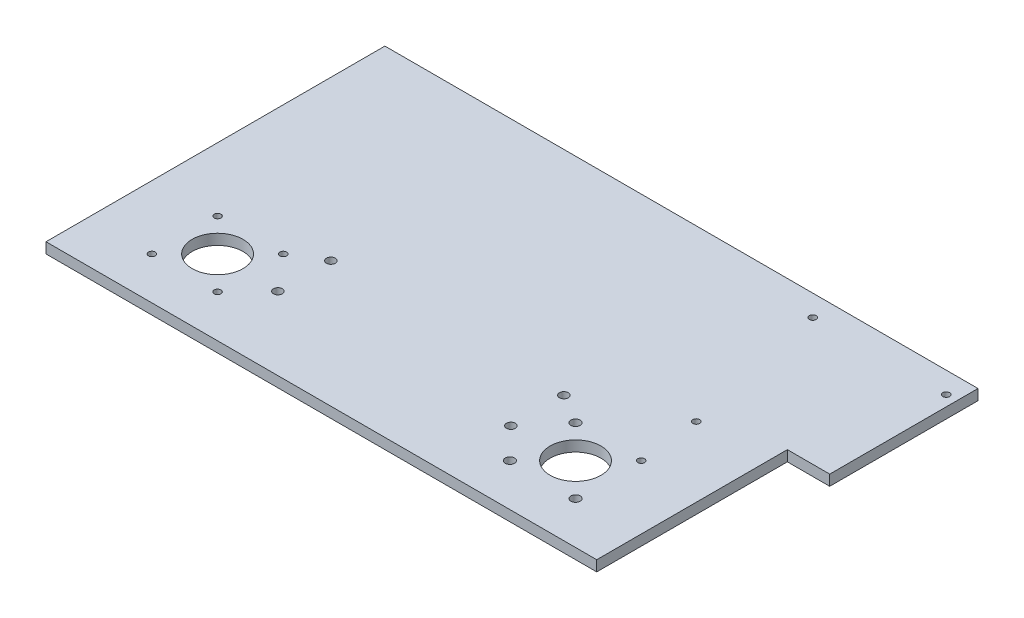
ISO-10303-21;
HEADER;
FILE_DESCRIPTION(('STEP AP214'),'2;1');
FILE_NAME('part.step','',(''),(''),'','','');
FILE_SCHEMA(('AUTOMOTIVE_DESIGN { 1 0 10303 214 1 1 1 1 }'));
ENDSEC;
DATA;
#1=APPLICATION_CONTEXT('core data for automotive mechanical design processes');
#2=APPLICATION_PROTOCOL_DEFINITION('international standard','automotive_design',2000,#1);
#3=PRODUCT_CONTEXT('',#1,'mechanical');
#4=PRODUCT('Part','Part','',(#3));
#5=PRODUCT_RELATED_PRODUCT_CATEGORY('part','',(#4));
#6=PRODUCT_DEFINITION_FORMATION('','',#4);
#7=PRODUCT_DEFINITION_CONTEXT('part definition',#1,'design');
#8=PRODUCT_DEFINITION('design','',#6,#7);
#9=PRODUCT_DEFINITION_SHAPE('','',#8);
#10=(LENGTH_UNIT() NAMED_UNIT(*) SI_UNIT(.MILLI.,.METRE.));
#11=(NAMED_UNIT(*) PLANE_ANGLE_UNIT() SI_UNIT($,.RADIAN.));
#12=(NAMED_UNIT(*) SI_UNIT($,.STERADIAN.) SOLID_ANGLE_UNIT());
#13=UNCERTAINTY_MEASURE_WITH_UNIT(LENGTH_MEASURE(1.E-05),#10,'distance_accuracy_value','');
#14=(GEOMETRIC_REPRESENTATION_CONTEXT(3) GLOBAL_UNCERTAINTY_ASSIGNED_CONTEXT((#13)) GLOBAL_UNIT_ASSIGNED_CONTEXT((#10,
#11,#12)) REPRESENTATION_CONTEXT('',''));
#15=CARTESIAN_POINT('',(0.,0.,0.));
#16=DIRECTION('',(0.,0.,1.));
#17=DIRECTION('',(1.,0.,0.));
#18=AXIS2_PLACEMENT_3D('',#15,#16,#17);
#19=CARTESIAN_POINT('',(0.,5.,80.));
#20=DIRECTION('',(0.,0.,-1.));
#21=DIRECTION('',(-1.,0.,0.));
#22=AXIS2_PLACEMENT_3D('',#19,#20,#21);
#23=PLANE('',#22);
#24=DIRECTION('',(1.,0.,0.));
#25=VECTOR('',#24,1.);
#26=CARTESIAN_POINT('',(0.,0.,80.));
#27=LINE('',#26,#25);
#28=CARTESIAN_POINT('',(-140.,0.,80.));
#29=VERTEX_POINT('',#28);
#30=CARTESIAN_POINT('',(120.,0.,80.));
#31=VERTEX_POINT('',#30);
#32=EDGE_CURVE('E169',#29,#31,#27,.T.);
#33=ORIENTED_EDGE('',*,*,#32,.T.);
#34=DIRECTION('',(0.,-1.,0.));
#35=VECTOR('',#34,1.);
#36=CARTESIAN_POINT('',(120.,5.,80.));
#37=LINE('',#36,#35);
#38=CARTESIAN_POINT('',(120.,5.,80.));
#39=VERTEX_POINT('',#38);
#40=EDGE_CURVE('E11',#39,#31,#37,.T.);
#41=ORIENTED_EDGE('',*,*,#40,.F.);
#42=DIRECTION('',(1.,0.,0.));
#43=VECTOR('',#42,1.);
#44=CARTESIAN_POINT('',(0.,5.,80.));
#45=LINE('',#44,#43);
#46=CARTESIAN_POINT('',(-140.,5.,80.));
#47=VERTEX_POINT('',#46);
#48=EDGE_CURVE('E530',#47,#39,#45,.T.);
#49=ORIENTED_EDGE('',*,*,#48,.F.);
#50=DIRECTION('',(0.,-1.,0.));
#51=VECTOR('',#50,1.);
#52=CARTESIAN_POINT('',(-140.,5.,80.));
#53=LINE('',#52,#51);
#54=EDGE_CURVE('E50',#47,#29,#53,.T.);
#55=ORIENTED_EDGE('',*,*,#54,.T.);
#56=EDGE_LOOP('',(#33,#41,#49,#55));
#57=FACE_BOUND('',#56,.T.);
#58=ADVANCED_FACE('F33',(#57),#23,.F.);
#59=CARTESIAN_POINT('',(120.,5.,0.));
#60=DIRECTION('',(-1.,0.,0.));
#61=DIRECTION('',(0.,0.,1.));
#62=AXIS2_PLACEMENT_3D('',#59,#60,#61);
#63=PLANE('',#62);
#64=DIRECTION('',(0.,0.,-1.));
#65=VECTOR('',#64,1.);
#66=CARTESIAN_POINT('',(120.,0.,0.));
#67=LINE('',#66,#65);
#68=CARTESIAN_POINT('',(120.,0.,-9.99999999999998));
#69=VERTEX_POINT('',#68);
#70=EDGE_CURVE('E171',#31,#69,#67,.T.);
#71=ORIENTED_EDGE('',*,*,#70,.T.);
#72=DIRECTION('',(0.,-1.,0.));
#73=VECTOR('',#72,1.);
#74=CARTESIAN_POINT('',(120.,5.,-9.99999999999998));
#75=LINE('',#74,#73);
#76=CARTESIAN_POINT('',(120.,5.,-9.99999999999998));
#77=VERTEX_POINT('',#76);
#78=EDGE_CURVE('E42',#77,#69,#75,.T.);
#79=ORIENTED_EDGE('',*,*,#78,.F.);
#80=DIRECTION('',(0.,0.,-1.));
#81=VECTOR('',#80,1.);
#82=CARTESIAN_POINT('',(120.,5.,0.));
#83=LINE('',#82,#81);
#84=EDGE_CURVE('E82',#39,#77,#83,.T.);
#85=ORIENTED_EDGE('',*,*,#84,.F.);
#86=ORIENTED_EDGE('',*,*,#40,.T.);
#87=EDGE_LOOP('',(#71,#79,#85,#86));
#88=FACE_BOUND('',#87,.T.);
#89=ADVANCED_FACE('F189',(#88),#63,.F.);
#90=CARTESIAN_POINT('',(0.,5.,-9.99999999999996));
#91=DIRECTION('',(0.,0.,1.));
#92=DIRECTION('',(1.,0.,0.));
#93=AXIS2_PLACEMENT_3D('',#90,#91,#92);
#94=PLANE('',#93);
#95=DIRECTION('',(-1.,0.,0.));
#96=VECTOR('',#95,1.);
#97=CARTESIAN_POINT('',(0.,0.,-9.99999999999996));
#98=LINE('',#97,#96);
#99=CARTESIAN_POINT('',(140.,0.,-9.99999999999998));
#100=VERTEX_POINT('',#99);
#101=EDGE_CURVE('E174',#100,#69,#98,.T.);
#102=ORIENTED_EDGE('',*,*,#101,.F.);
#103=DIRECTION('',(0.,-1.,0.));
#104=VECTOR('',#103,1.);
#105=CARTESIAN_POINT('',(140.,5.,-9.99999999999998));
#106=LINE('',#105,#104);
#107=CARTESIAN_POINT('',(140.,5.,-9.99999999999998));
#108=VERTEX_POINT('',#107);
#109=EDGE_CURVE('E110',#108,#100,#106,.T.);
#110=ORIENTED_EDGE('',*,*,#109,.F.);
#111=DIRECTION('',(-1.,0.,0.));
#112=VECTOR('',#111,1.);
#113=CARTESIAN_POINT('',(0.,5.,-9.99999999999996));
#114=LINE('',#113,#112);
#115=EDGE_CURVE('E100',#108,#77,#114,.T.);
#116=ORIENTED_EDGE('',*,*,#115,.T.);
#117=ORIENTED_EDGE('',*,*,#78,.T.);
#118=EDGE_LOOP('',(#102,#110,#116,#117));
#119=FACE_BOUND('',#118,.T.);
#120=ADVANCED_FACE('F188',(#119),#94,.T.);
#121=CARTESIAN_POINT('',(140.,5.,0.));
#122=DIRECTION('',(-1.,0.,0.));
#123=DIRECTION('',(0.,0.,1.));
#124=AXIS2_PLACEMENT_3D('',#121,#122,#123);
#125=PLANE('',#124);
#126=DIRECTION('',(0.,0.,-1.));
#127=VECTOR('',#126,1.);
#128=CARTESIAN_POINT('',(140.,0.,0.));
#129=LINE('',#128,#127);
#130=CARTESIAN_POINT('',(140.,0.,-80.));
#131=VERTEX_POINT('',#130);
#132=EDGE_CURVE('E107',#100,#131,#129,.T.);
#133=ORIENTED_EDGE('',*,*,#132,.T.);
#134=DIRECTION('',(0.,-1.,0.));
#135=VECTOR('',#134,1.);
#136=CARTESIAN_POINT('',(140.,5.,-80.));
#137=LINE('',#136,#135);
#138=CARTESIAN_POINT('',(140.,5.,-80.));
#139=VERTEX_POINT('',#138);
#140=EDGE_CURVE('E104',#139,#131,#137,.T.);
#141=ORIENTED_EDGE('',*,*,#140,.F.);
#142=DIRECTION('',(0.,0.,-1.));
#143=VECTOR('',#142,1.);
#144=CARTESIAN_POINT('',(140.,5.,0.));
#145=LINE('',#144,#143);
#146=EDGE_CURVE('E93',#108,#139,#145,.T.);
#147=ORIENTED_EDGE('',*,*,#146,.F.);
#148=ORIENTED_EDGE('',*,*,#109,.T.);
#149=EDGE_LOOP('',(#133,#141,#147,#148));
#150=FACE_BOUND('',#149,.T.);
#151=ADVANCED_FACE('F105',(#150),#125,.F.);
#152=CARTESIAN_POINT('',(0.,5.,-80.));
#153=DIRECTION('',(0.,0.,-1.));
#154=DIRECTION('',(-1.,0.,0.));
#155=AXIS2_PLACEMENT_3D('',#152,#153,#154);
#156=PLANE('',#155);
#157=DIRECTION('',(1.,0.,0.));
#158=VECTOR('',#157,1.);
#159=CARTESIAN_POINT('',(0.,0.,-80.));
#160=LINE('',#159,#158);
#161=CARTESIAN_POINT('',(-140.,0.,-80.));
#162=VERTEX_POINT('',#161);
#163=EDGE_CURVE('E178',#162,#131,#160,.T.);
#164=ORIENTED_EDGE('',*,*,#163,.F.);
#165=DIRECTION('',(0.,-1.,0.));
#166=VECTOR('',#165,1.);
#167=CARTESIAN_POINT('',(-140.,5.,-80.));
#168=LINE('',#167,#166);
#169=CARTESIAN_POINT('',(-140.,5.,-80.));
#170=VERTEX_POINT('',#169);
#171=EDGE_CURVE('E70',#170,#162,#168,.T.);
#172=ORIENTED_EDGE('',*,*,#171,.F.);
#173=DIRECTION('',(1.,0.,0.));
#174=VECTOR('',#173,1.);
#175=CARTESIAN_POINT('',(0.,5.,-80.));
#176=LINE('',#175,#174);
#177=EDGE_CURVE('E98',#170,#139,#176,.T.);
#178=ORIENTED_EDGE('',*,*,#177,.T.);
#179=ORIENTED_EDGE('',*,*,#140,.T.);
#180=EDGE_LOOP('',(#164,#172,#178,#179));
#181=FACE_BOUND('',#180,.T.);
#182=ADVANCED_FACE('F112',(#181),#156,.T.);
#183=CARTESIAN_POINT('',(90.,5.,29.));
#184=DIRECTION('',(0.,-1.,0.));
#185=DIRECTION('',(0.,0.,-1.));
#186=AXIS2_PLACEMENT_3D('',#183,#184,#185);
#187=CYLINDRICAL_SURFACE('',#186,1.6);
#188=CARTESIAN_POINT('',(90.,5.,29.));
#189=DIRECTION('',(0.,1.,0.));
#190=DIRECTION('',(0.,0.,1.));
#191=AXIS2_PLACEMENT_3D('',#188,#189,#190);
#192=CIRCLE('',#191,1.6);
#193=CARTESIAN_POINT('',(90.,5.,30.6));
#194=VERTEX_POINT('',#193);
#195=EDGE_CURVE('E527',#194,#194,#192,.T.);
#196=ORIENTED_EDGE('',*,*,#195,.T.);
#197=EDGE_LOOP('',(#196));
#198=FACE_BOUND('',#197,.T.);
#199=CARTESIAN_POINT('',(90.,0.,29.));
#200=DIRECTION('',(0.,1.,0.));
#201=DIRECTION('',(0.,0.,1.));
#202=AXIS2_PLACEMENT_3D('',#199,#200,#201);
#203=CIRCLE('',#202,1.6);
#204=CARTESIAN_POINT('',(90.,0.,30.6));
#205=VERTEX_POINT('',#204);
#206=EDGE_CURVE('E166',#205,#205,#203,.T.);
#207=ORIENTED_EDGE('',*,*,#206,.F.);
#208=EDGE_LOOP('',(#207));
#209=FACE_BOUND('',#208,.T.);
#210=ADVANCED_FACE('F214',(#198,#209),#187,.F.);
#211=CARTESIAN_POINT('',(59.,5.,29.));
#212=DIRECTION('',(0.,-1.,0.));
#213=DIRECTION('',(0.,0.,-1.));
#214=AXIS2_PLACEMENT_3D('',#211,#212,#213);
#215=CYLINDRICAL_SURFACE('',#214,2.2);
#216=CARTESIAN_POINT('',(59.,5.,29.));
#217=DIRECTION('',(0.,1.,0.));
#218=DIRECTION('',(0.,0.,1.));
#219=AXIS2_PLACEMENT_3D('',#216,#217,#218);
#220=CIRCLE('',#219,2.2);
#221=CARTESIAN_POINT('',(59.,5.,31.2));
#222=VERTEX_POINT('',#221);
#223=EDGE_CURVE('E524',#222,#222,#220,.T.);
#224=ORIENTED_EDGE('',*,*,#223,.T.);
#225=EDGE_LOOP('',(#224));
#226=FACE_BOUND('',#225,.T.);
#227=CARTESIAN_POINT('',(59.,0.,29.));
#228=DIRECTION('',(0.,1.,0.));
#229=DIRECTION('',(0.,0.,1.));
#230=AXIS2_PLACEMENT_3D('',#227,#228,#229);
#231=CIRCLE('',#230,2.2);
#232=CARTESIAN_POINT('',(59.,0.,31.2));
#233=VERTEX_POINT('',#232);
#234=EDGE_CURVE('E163',#233,#233,#231,.T.);
#235=ORIENTED_EDGE('',*,*,#234,.F.);
#236=EDGE_LOOP('',(#235));
#237=FACE_BOUND('',#236,.T.);
#238=ADVANCED_FACE('F217',(#226,#237),#215,.F.);
#239=CARTESIAN_POINT('',(90.,5.,60.));
#240=DIRECTION('',(0.,-1.,0.));
#241=DIRECTION('',(0.,0.,-1.));
#242=AXIS2_PLACEMENT_3D('',#239,#240,#241);
#243=CYLINDRICAL_SURFACE('',#242,2.2);
#244=CARTESIAN_POINT('',(90.,5.,60.));
#245=DIRECTION('',(0.,1.,0.));
#246=DIRECTION('',(0.,0.,1.));
#247=AXIS2_PLACEMENT_3D('',#244,#245,#246);
#248=CIRCLE('',#247,2.2);
#249=CARTESIAN_POINT('',(90.,5.,62.2));
#250=VERTEX_POINT('',#249);
#251=EDGE_CURVE('E521',#250,#250,#248,.T.);
#252=ORIENTED_EDGE('',*,*,#251,.T.);
#253=EDGE_LOOP('',(#252));
#254=FACE_BOUND('',#253,.T.);
#255=CARTESIAN_POINT('',(90.,0.,60.));
#256=DIRECTION('',(0.,1.,0.));
#257=DIRECTION('',(0.,0.,1.));
#258=AXIS2_PLACEMENT_3D('',#255,#256,#257);
#259=CIRCLE('',#258,2.2);
#260=CARTESIAN_POINT('',(90.,0.,62.2));
#261=VERTEX_POINT('',#260);
#262=EDGE_CURVE('E160',#261,#261,#259,.T.);
#263=ORIENTED_EDGE('',*,*,#262,.F.);
#264=EDGE_LOOP('',(#263));
#265=FACE_BOUND('',#264,.T.);
#266=ADVANCED_FACE('F221',(#254,#265),#243,.F.);
#267=CARTESIAN_POINT('',(59.,5.,60.));
#268=DIRECTION('',(0.,-1.,0.));
#269=DIRECTION('',(0.,0.,-1.));
#270=AXIS2_PLACEMENT_3D('',#267,#268,#269);
#271=CYLINDRICAL_SURFACE('',#270,2.19999999999999);
#272=CARTESIAN_POINT('',(59.,5.,60.));
#273=DIRECTION('',(0.,1.,0.));
#274=DIRECTION('',(0.,0.,1.));
#275=AXIS2_PLACEMENT_3D('',#272,#273,#274);
#276=CIRCLE('',#275,2.19999999999999);
#277=CARTESIAN_POINT('',(59.,5.,62.2));
#278=VERTEX_POINT('',#277);
#279=EDGE_CURVE('E518',#278,#278,#276,.T.);
#280=ORIENTED_EDGE('',*,*,#279,.T.);
#281=EDGE_LOOP('',(#280));
#282=FACE_BOUND('',#281,.T.);
#283=CARTESIAN_POINT('',(59.,0.,60.));
#284=DIRECTION('',(0.,1.,0.));
#285=DIRECTION('',(0.,0.,1.));
#286=AXIS2_PLACEMENT_3D('',#283,#284,#285);
#287=CIRCLE('',#286,2.19999999999999);
#288=CARTESIAN_POINT('',(59.,0.,62.2));
#289=VERTEX_POINT('',#288);
#290=EDGE_CURVE('E157',#289,#289,#287,.T.);
#291=ORIENTED_EDGE('',*,*,#290,.F.);
#292=EDGE_LOOP('',(#291));
#293=FACE_BOUND('',#292,.T.);
#294=ADVANCED_FACE('F225',(#282,#293),#271,.F.);
#295=CARTESIAN_POINT('',(-79.0000000000001,5.,29.));
#296=DIRECTION('',(0.,-1.,0.));
#297=DIRECTION('',(0.,0.,-1.));
#298=AXIS2_PLACEMENT_3D('',#295,#296,#297);
#299=CYLINDRICAL_SURFACE('',#298,1.6);
#300=CARTESIAN_POINT('',(-79.0000000000001,5.,29.));
#301=DIRECTION('',(0.,1.,0.));
#302=DIRECTION('',(0.,0.,1.));
#303=AXIS2_PLACEMENT_3D('',#300,#301,#302);
#304=CIRCLE('',#303,1.6);
#305=CARTESIAN_POINT('',(-79.0000000000001,5.,30.6));
#306=VERTEX_POINT('',#305);
#307=EDGE_CURVE('E515',#306,#306,#304,.T.);
#308=ORIENTED_EDGE('',*,*,#307,.T.);
#309=EDGE_LOOP('',(#308));
#310=FACE_BOUND('',#309,.T.);
#311=CARTESIAN_POINT('',(-79.0000000000001,0.,29.));
#312=DIRECTION('',(0.,1.,0.));
#313=DIRECTION('',(0.,0.,1.));
#314=AXIS2_PLACEMENT_3D('',#311,#312,#313);
#315=CIRCLE('',#314,1.6);
#316=CARTESIAN_POINT('',(-79.0000000000001,0.,30.6));
#317=VERTEX_POINT('',#316);
#318=EDGE_CURVE('E154',#317,#317,#315,.T.);
#319=ORIENTED_EDGE('',*,*,#318,.F.);
#320=EDGE_LOOP('',(#319));
#321=FACE_BOUND('',#320,.T.);
#322=ADVANCED_FACE('F229',(#310,#321),#299,.F.);
#323=CARTESIAN_POINT('',(-110.,5.,29.));
#324=DIRECTION('',(0.,-1.,0.));
#325=DIRECTION('',(0.,0.,-1.));
#326=AXIS2_PLACEMENT_3D('',#323,#324,#325);
#327=CYLINDRICAL_SURFACE('',#326,1.6);
#328=CARTESIAN_POINT('',(-110.,5.,29.));
#329=DIRECTION('',(0.,1.,0.));
#330=DIRECTION('',(0.,0.,1.));
#331=AXIS2_PLACEMENT_3D('',#328,#329,#330);
#332=CIRCLE('',#331,1.6);
#333=CARTESIAN_POINT('',(-110.,5.,30.6));
#334=VERTEX_POINT('',#333);
#335=EDGE_CURVE('E512',#334,#334,#332,.T.);
#336=ORIENTED_EDGE('',*,*,#335,.T.);
#337=EDGE_LOOP('',(#336));
#338=FACE_BOUND('',#337,.T.);
#339=CARTESIAN_POINT('',(-110.,0.,29.));
#340=DIRECTION('',(0.,1.,0.));
#341=DIRECTION('',(0.,0.,1.));
#342=AXIS2_PLACEMENT_3D('',#339,#340,#341);
#343=CIRCLE('',#342,1.6);
#344=CARTESIAN_POINT('',(-110.,0.,30.6));
#345=VERTEX_POINT('',#344);
#346=EDGE_CURVE('E151',#345,#345,#343,.T.);
#347=ORIENTED_EDGE('',*,*,#346,.F.);
#348=EDGE_LOOP('',(#347));
#349=FACE_BOUND('',#348,.T.);
#350=ADVANCED_FACE('F233',(#338,#349),#327,.F.);
#351=CARTESIAN_POINT('',(-79.0000000000001,5.,60.));
#352=DIRECTION('',(0.,-1.,0.));
#353=DIRECTION('',(0.,0.,-1.));
#354=AXIS2_PLACEMENT_3D('',#351,#352,#353);
#355=CYLINDRICAL_SURFACE('',#354,1.60000000000001);
#356=CARTESIAN_POINT('',(-79.0000000000001,5.,60.));
#357=DIRECTION('',(0.,1.,0.));
#358=DIRECTION('',(0.,0.,1.));
#359=AXIS2_PLACEMENT_3D('',#356,#357,#358);
#360=CIRCLE('',#359,1.60000000000001);
#361=CARTESIAN_POINT('',(-79.0000000000001,5.,61.6));
#362=VERTEX_POINT('',#361);
#363=EDGE_CURVE('E509',#362,#362,#360,.T.);
#364=ORIENTED_EDGE('',*,*,#363,.T.);
#365=EDGE_LOOP('',(#364));
#366=FACE_BOUND('',#365,.T.);
#367=CARTESIAN_POINT('',(-79.0000000000001,0.,60.));
#368=DIRECTION('',(0.,1.,0.));
#369=DIRECTION('',(0.,0.,1.));
#370=AXIS2_PLACEMENT_3D('',#367,#368,#369);
#371=CIRCLE('',#370,1.60000000000001);
#372=CARTESIAN_POINT('',(-79.0000000000001,0.,61.6));
#373=VERTEX_POINT('',#372);
#374=EDGE_CURVE('E148',#373,#373,#371,.T.);
#375=ORIENTED_EDGE('',*,*,#374,.F.);
#376=EDGE_LOOP('',(#375));
#377=FACE_BOUND('',#376,.T.);
#378=ADVANCED_FACE('F237',(#366,#377),#355,.F.);
#379=CARTESIAN_POINT('',(-110.,5.,60.));
#380=DIRECTION('',(0.,-1.,0.));
#381=DIRECTION('',(0.,0.,-1.));
#382=AXIS2_PLACEMENT_3D('',#379,#380,#381);
#383=CYLINDRICAL_SURFACE('',#382,1.60000000000001);
#384=CARTESIAN_POINT('',(-110.,5.,60.));
#385=DIRECTION('',(0.,1.,0.));
#386=DIRECTION('',(0.,0.,1.));
#387=AXIS2_PLACEMENT_3D('',#384,#385,#386);
#388=CIRCLE('',#387,1.60000000000001);
#389=CARTESIAN_POINT('',(-110.,5.,61.6));
#390=VERTEX_POINT('',#389);
#391=EDGE_CURVE('E506',#390,#390,#388,.T.);
#392=ORIENTED_EDGE('',*,*,#391,.T.);
#393=EDGE_LOOP('',(#392));
#394=FACE_BOUND('',#393,.T.);
#395=CARTESIAN_POINT('',(-110.,0.,60.));
#396=DIRECTION('',(0.,1.,0.));
#397=DIRECTION('',(0.,0.,1.));
#398=AXIS2_PLACEMENT_3D('',#395,#396,#397);
#399=CIRCLE('',#398,1.60000000000001);
#400=CARTESIAN_POINT('',(-110.,0.,61.6));
#401=VERTEX_POINT('',#400);
#402=EDGE_CURVE('E145',#401,#401,#399,.T.);
#403=ORIENTED_EDGE('',*,*,#402,.F.);
#404=EDGE_LOOP('',(#403));
#405=FACE_BOUND('',#404,.T.);
#406=ADVANCED_FACE('F241',(#394,#405),#383,.F.);
#407=CARTESIAN_POINT('',(45.,5.,20.5));
#408=DIRECTION('',(0.,-1.,0.));
#409=DIRECTION('',(0.,0.,-1.));
#410=AXIS2_PLACEMENT_3D('',#407,#408,#409);
#411=CYLINDRICAL_SURFACE('',#410,2.1);
#412=CARTESIAN_POINT('',(45.,5.,20.5));
#413=DIRECTION('',(0.,1.,0.));
#414=DIRECTION('',(0.,0.,1.));
#415=AXIS2_PLACEMENT_3D('',#412,#413,#414);
#416=CIRCLE('',#415,2.1);
#417=CARTESIAN_POINT('',(45.,5.,22.6));
#418=VERTEX_POINT('',#417);
#419=EDGE_CURVE('E503',#418,#418,#416,.T.);
#420=ORIENTED_EDGE('',*,*,#419,.T.);
#421=EDGE_LOOP('',(#420));
#422=FACE_BOUND('',#421,.T.);
#423=CARTESIAN_POINT('',(45.,0.,20.5));
#424=DIRECTION('',(0.,1.,0.));
#425=DIRECTION('',(0.,0.,1.));
#426=AXIS2_PLACEMENT_3D('',#423,#424,#425);
#427=CIRCLE('',#426,2.1);
#428=CARTESIAN_POINT('',(45.,0.,22.6));
#429=VERTEX_POINT('',#428);
#430=EDGE_CURVE('E142',#429,#429,#427,.T.);
#431=ORIENTED_EDGE('',*,*,#430,.F.);
#432=EDGE_LOOP('',(#431));
#433=FACE_BOUND('',#432,.T.);
#434=ADVANCED_FACE('F245',(#422,#433),#411,.F.);
#435=CARTESIAN_POINT('',(45.,5.,45.5));
#436=DIRECTION('',(0.,-1.,0.));
#437=DIRECTION('',(0.,0.,-1.));
#438=AXIS2_PLACEMENT_3D('',#435,#436,#437);
#439=CYLINDRICAL_SURFACE('',#438,2.1);
#440=CARTESIAN_POINT('',(45.,5.,45.5));
#441=DIRECTION('',(0.,1.,0.));
#442=DIRECTION('',(0.,0.,1.));
#443=AXIS2_PLACEMENT_3D('',#440,#441,#442);
#444=CIRCLE('',#443,2.1);
#445=CARTESIAN_POINT('',(45.,5.,47.6));
#446=VERTEX_POINT('',#445);
#447=EDGE_CURVE('E500',#446,#446,#444,.T.);
#448=ORIENTED_EDGE('',*,*,#447,.T.);
#449=EDGE_LOOP('',(#448));
#450=FACE_BOUND('',#449,.T.);
#451=CARTESIAN_POINT('',(45.,0.,45.5));
#452=DIRECTION('',(0.,1.,0.));
#453=DIRECTION('',(0.,0.,1.));
#454=AXIS2_PLACEMENT_3D('',#451,#452,#453);
#455=CIRCLE('',#454,2.1);
#456=CARTESIAN_POINT('',(45.,0.,47.6));
#457=VERTEX_POINT('',#456);
#458=EDGE_CURVE('E139',#457,#457,#455,.T.);
#459=ORIENTED_EDGE('',*,*,#458,.F.);
#460=EDGE_LOOP('',(#459));
#461=FACE_BOUND('',#460,.T.);
#462=ADVANCED_FACE('F249',(#450,#461),#439,.F.);
#463=CARTESIAN_POINT('',(-65.,5.,45.5));
#464=DIRECTION('',(0.,-1.,0.));
#465=DIRECTION('',(0.,0.,-1.));
#466=AXIS2_PLACEMENT_3D('',#463,#464,#465);
#467=CYLINDRICAL_SURFACE('',#466,2.1);
#468=CARTESIAN_POINT('',(-65.,5.,45.5));
#469=DIRECTION('',(0.,1.,0.));
#470=DIRECTION('',(0.,0.,1.));
#471=AXIS2_PLACEMENT_3D('',#468,#469,#470);
#472=CIRCLE('',#471,2.1);
#473=CARTESIAN_POINT('',(-65.,5.,47.6));
#474=VERTEX_POINT('',#473);
#475=EDGE_CURVE('E497',#474,#474,#472,.T.);
#476=ORIENTED_EDGE('',*,*,#475,.T.);
#477=EDGE_LOOP('',(#476));
#478=FACE_BOUND('',#477,.T.);
#479=CARTESIAN_POINT('',(-65.,0.,45.5));
#480=DIRECTION('',(0.,1.,0.));
#481=DIRECTION('',(0.,0.,1.));
#482=AXIS2_PLACEMENT_3D('',#479,#480,#481);
#483=CIRCLE('',#482,2.1);
#484=CARTESIAN_POINT('',(-65.,0.,47.6));
#485=VERTEX_POINT('',#484);
#486=EDGE_CURVE('E136',#485,#485,#483,.T.);
#487=ORIENTED_EDGE('',*,*,#486,.F.);
#488=EDGE_LOOP('',(#487));
#489=FACE_BOUND('',#488,.T.);
#490=ADVANCED_FACE('F253',(#478,#489),#467,.F.);
#491=CARTESIAN_POINT('',(-65.,5.,20.5));
#492=DIRECTION('',(0.,-1.,0.));
#493=DIRECTION('',(0.,0.,-1.));
#494=AXIS2_PLACEMENT_3D('',#491,#492,#493);
#495=CYLINDRICAL_SURFACE('',#494,2.1);
#496=CARTESIAN_POINT('',(-65.,5.,20.5));
#497=DIRECTION('',(0.,1.,0.));
#498=DIRECTION('',(0.,0.,1.));
#499=AXIS2_PLACEMENT_3D('',#496,#497,#498);
#500=CIRCLE('',#499,2.1);
#501=CARTESIAN_POINT('',(-65.,5.,22.6));
#502=VERTEX_POINT('',#501);
#503=EDGE_CURVE('E494',#502,#502,#500,.T.);
#504=ORIENTED_EDGE('',*,*,#503,.T.);
#505=EDGE_LOOP('',(#504));
#506=FACE_BOUND('',#505,.T.);
#507=CARTESIAN_POINT('',(-65.,0.,20.5));
#508=DIRECTION('',(0.,1.,0.));
#509=DIRECTION('',(0.,0.,1.));
#510=AXIS2_PLACEMENT_3D('',#507,#508,#509);
#511=CIRCLE('',#510,2.1);
#512=CARTESIAN_POINT('',(-65.,0.,22.6));
#513=VERTEX_POINT('',#512);
#514=EDGE_CURVE('E133',#513,#513,#511,.T.);
#515=ORIENTED_EDGE('',*,*,#514,.F.);
#516=EDGE_LOOP('',(#515));
#517=FACE_BOUND('',#516,.T.);
#518=ADVANCED_FACE('F257',(#506,#517),#495,.F.);
#519=CARTESIAN_POINT('',(74.5,5.,44.5));
#520=DIRECTION('',(0.,-1.,0.));
#521=DIRECTION('',(0.,0.,-1.));
#522=AXIS2_PLACEMENT_3D('',#519,#520,#521);
#523=CYLINDRICAL_SURFACE('',#522,12.);
#524=CARTESIAN_POINT('',(74.5,5.,44.5));
#525=DIRECTION('',(0.,1.,0.));
#526=DIRECTION('',(0.,0.,1.));
#527=AXIS2_PLACEMENT_3D('',#524,#525,#526);
#528=CIRCLE('',#527,12.);
#529=CARTESIAN_POINT('',(74.5,5.,56.5));
#530=VERTEX_POINT('',#529);
#531=EDGE_CURVE('E491',#530,#530,#528,.T.);
#532=ORIENTED_EDGE('',*,*,#531,.T.);
#533=EDGE_LOOP('',(#532));
#534=FACE_BOUND('',#533,.T.);
#535=CARTESIAN_POINT('',(74.5,0.,44.5));
#536=DIRECTION('',(0.,1.,0.));
#537=DIRECTION('',(0.,0.,1.));
#538=AXIS2_PLACEMENT_3D('',#535,#536,#537);
#539=CIRCLE('',#538,12.);
#540=CARTESIAN_POINT('',(74.5,0.,56.5));
#541=VERTEX_POINT('',#540);
#542=EDGE_CURVE('E130',#541,#541,#539,.T.);
#543=ORIENTED_EDGE('',*,*,#542,.F.);
#544=EDGE_LOOP('',(#543));
#545=FACE_BOUND('',#544,.T.);
#546=ADVANCED_FACE('F261',(#534,#545),#523,.F.);
#547=CARTESIAN_POINT('',(-94.5000000000001,5.,44.5));
#548=DIRECTION('',(0.,-1.,0.));
#549=DIRECTION('',(0.,0.,-1.));
#550=AXIS2_PLACEMENT_3D('',#547,#548,#549);
#551=CYLINDRICAL_SURFACE('',#550,12.);
#552=CARTESIAN_POINT('',(-94.5000000000001,5.,44.5));
#553=DIRECTION('',(0.,1.,0.));
#554=DIRECTION('',(0.,0.,1.));
#555=AXIS2_PLACEMENT_3D('',#552,#553,#554);
#556=CIRCLE('',#555,12.);
#557=CARTESIAN_POINT('',(-94.5000000000001,5.,56.5));
#558=VERTEX_POINT('',#557);
#559=EDGE_CURVE('E484',#558,#558,#556,.T.);
#560=ORIENTED_EDGE('',*,*,#559,.T.);
#561=EDGE_LOOP('',(#560));
#562=FACE_BOUND('',#561,.T.);
#563=CARTESIAN_POINT('',(-94.5000000000001,0.,44.5));
#564=DIRECTION('',(0.,1.,0.));
#565=DIRECTION('',(0.,0.,1.));
#566=AXIS2_PLACEMENT_3D('',#563,#564,#565);
#567=CIRCLE('',#566,12.);
#568=CARTESIAN_POINT('',(-94.5000000000001,0.,56.5));
#569=VERTEX_POINT('',#568);
#570=EDGE_CURVE('E127',#569,#569,#567,.T.);
#571=ORIENTED_EDGE('',*,*,#570,.F.);
#572=EDGE_LOOP('',(#571));
#573=FACE_BOUND('',#572,.T.);
#574=ADVANCED_FACE('F265',(#562,#573),#551,.F.);
#575=CARTESIAN_POINT('',(87.,5.,0.));
#576=DIRECTION('',(0.,-1.,0.));
#577=DIRECTION('',(0.,0.,-1.));
#578=AXIS2_PLACEMENT_3D('',#575,#576,#577);
#579=CYLINDRICAL_SURFACE('',#578,1.60000000000001);
#580=CARTESIAN_POINT('',(87.,5.,0.));
#581=DIRECTION('',(0.,1.,0.));
#582=DIRECTION('',(0.,0.,1.));
#583=AXIS2_PLACEMENT_3D('',#580,#581,#582);
#584=CIRCLE('',#583,1.60000000000001);
#585=CARTESIAN_POINT('',(87.,5.,1.59999999999999));
#586=VERTEX_POINT('',#585);
#587=EDGE_CURVE('E481',#586,#586,#584,.T.);
#588=ORIENTED_EDGE('',*,*,#587,.T.);
#589=EDGE_LOOP('',(#588));
#590=FACE_BOUND('',#589,.T.);
#591=CARTESIAN_POINT('',(87.,0.,0.));
#592=DIRECTION('',(0.,1.,0.));
#593=DIRECTION('',(0.,0.,1.));
#594=AXIS2_PLACEMENT_3D('',#591,#592,#593);
#595=CIRCLE('',#594,1.60000000000001);
#596=CARTESIAN_POINT('',(87.,0.,1.59999999999999));
#597=VERTEX_POINT('',#596);
#598=EDGE_CURVE('E124',#597,#597,#595,.T.);
#599=ORIENTED_EDGE('',*,*,#598,.F.);
#600=EDGE_LOOP('',(#599));
#601=FACE_BOUND('',#600,.T.);
#602=ADVANCED_FACE('F269',(#590,#601),#579,.F.);
#603=CARTESIAN_POINT('',(72.,5.,-70.));
#604=DIRECTION('',(0.,-1.,0.));
#605=DIRECTION('',(0.,0.,-1.));
#606=AXIS2_PLACEMENT_3D('',#603,#604,#605);
#607=CYLINDRICAL_SURFACE('',#606,1.60000000000001);
#608=CARTESIAN_POINT('',(72.,5.,-70.));
#609=DIRECTION('',(0.,1.,0.));
#610=DIRECTION('',(0.,0.,1.));
#611=AXIS2_PLACEMENT_3D('',#608,#609,#610);
#612=CIRCLE('',#611,1.60000000000001);
#613=CARTESIAN_POINT('',(72.,5.,-68.4));
#614=VERTEX_POINT('',#613);
#615=EDGE_CURVE('E280',#614,#614,#612,.T.);
#616=ORIENTED_EDGE('',*,*,#615,.T.);
#617=EDGE_LOOP('',(#616));
#618=FACE_BOUND('',#617,.T.);
#619=CARTESIAN_POINT('',(72.,0.,-70.));
#620=DIRECTION('',(0.,1.,0.));
#621=DIRECTION('',(0.,0.,1.));
#622=AXIS2_PLACEMENT_3D('',#619,#620,#621);
#623=CIRCLE('',#622,1.60000000000001);
#624=CARTESIAN_POINT('',(72.,0.,-68.4));
#625=VERTEX_POINT('',#624);
#626=EDGE_CURVE('E121',#625,#625,#623,.T.);
#627=ORIENTED_EDGE('',*,*,#626,.F.);
#628=EDGE_LOOP('',(#627));
#629=FACE_BOUND('',#628,.T.);
#630=ADVANCED_FACE('F202',(#618,#629),#607,.F.);
#631=CARTESIAN_POINT('',(135.,5.,-70.));
#632=DIRECTION('',(0.,-1.,0.));
#633=DIRECTION('',(0.,0.,-1.));
#634=AXIS2_PLACEMENT_3D('',#631,#632,#633);
#635=CYLINDRICAL_SURFACE('',#634,1.59999999999999);
#636=CARTESIAN_POINT('',(135.,5.,-70.));
#637=DIRECTION('',(0.,1.,0.));
#638=DIRECTION('',(0.,0.,1.));
#639=AXIS2_PLACEMENT_3D('',#636,#637,#638);
#640=CIRCLE('',#639,1.59999999999999);
#641=CARTESIAN_POINT('',(135.,5.,-68.4));
#642=VERTEX_POINT('',#641);
#643=EDGE_CURVE('E183',#642,#642,#640,.T.);
#644=ORIENTED_EDGE('',*,*,#643,.T.);
#645=EDGE_LOOP('',(#644));
#646=FACE_BOUND('',#645,.T.);
#647=CARTESIAN_POINT('',(135.,0.,-70.));
#648=DIRECTION('',(0.,1.,0.));
#649=DIRECTION('',(0.,0.,1.));
#650=AXIS2_PLACEMENT_3D('',#647,#648,#649);
#651=CIRCLE('',#650,1.59999999999999);
#652=CARTESIAN_POINT('',(135.,0.,-68.4));
#653=VERTEX_POINT('',#652);
#654=EDGE_CURVE('E118',#653,#653,#651,.T.);
#655=ORIENTED_EDGE('',*,*,#654,.F.);
#656=EDGE_LOOP('',(#655));
#657=FACE_BOUND('',#656,.T.);
#658=ADVANCED_FACE('F35',(#646,#657),#635,.F.);
#659=CARTESIAN_POINT('',(-140.,5.,0.));
#660=DIRECTION('',(-1.,0.,0.));
#661=DIRECTION('',(0.,0.,1.));
#662=AXIS2_PLACEMENT_3D('',#659,#660,#661);
#663=PLANE('',#662);
#664=DIRECTION('',(0.,0.,-1.));
#665=VECTOR('',#664,1.);
#666=CARTESIAN_POINT('',(-140.,0.,0.));
#667=LINE('',#666,#665);
#668=EDGE_CURVE('E180',#29,#162,#667,.T.);
#669=ORIENTED_EDGE('',*,*,#668,.F.);
#670=ORIENTED_EDGE('',*,*,#54,.F.);
#671=DIRECTION('',(0.,0.,-1.));
#672=VECTOR('',#671,1.);
#673=CARTESIAN_POINT('',(-140.,5.,0.));
#674=LINE('',#673,#672);
#675=EDGE_CURVE('E113',#47,#170,#674,.T.);
#676=ORIENTED_EDGE('',*,*,#675,.T.);
#677=ORIENTED_EDGE('',*,*,#171,.T.);
#678=EDGE_LOOP('',(#669,#670,#676,#677));
#679=FACE_BOUND('',#678,.T.);
#680=ADVANCED_FACE('F193',(#679),#663,.T.);
#681=CARTESIAN_POINT('',(0.,5.,0.));
#682=DIRECTION('',(0.,1.,0.));
#683=DIRECTION('',(0.,0.,1.));
#684=AXIS2_PLACEMENT_3D('',#681,#682,#683);
#685=PLANE('',#684);
#686=ORIENTED_EDGE('',*,*,#643,.F.);
#687=EDGE_LOOP('',(#686));
#688=FACE_BOUND('',#687,.T.);
#689=ORIENTED_EDGE('',*,*,#615,.F.);
#690=EDGE_LOOP('',(#689));
#691=FACE_BOUND('',#690,.T.);
#692=ORIENTED_EDGE('',*,*,#587,.F.);
#693=EDGE_LOOP('',(#692));
#694=FACE_BOUND('',#693,.T.);
#695=ORIENTED_EDGE('',*,*,#559,.F.);
#696=EDGE_LOOP('',(#695));
#697=FACE_BOUND('',#696,.T.);
#698=ORIENTED_EDGE('',*,*,#531,.F.);
#699=EDGE_LOOP('',(#698));
#700=FACE_BOUND('',#699,.T.);
#701=ORIENTED_EDGE('',*,*,#503,.F.);
#702=EDGE_LOOP('',(#701));
#703=FACE_BOUND('',#702,.T.);
#704=ORIENTED_EDGE('',*,*,#475,.F.);
#705=EDGE_LOOP('',(#704));
#706=FACE_BOUND('',#705,.T.);
#707=ORIENTED_EDGE('',*,*,#447,.F.);
#708=EDGE_LOOP('',(#707));
#709=FACE_BOUND('',#708,.T.);
#710=ORIENTED_EDGE('',*,*,#419,.F.);
#711=EDGE_LOOP('',(#710));
#712=FACE_BOUND('',#711,.T.);
#713=ORIENTED_EDGE('',*,*,#391,.F.);
#714=EDGE_LOOP('',(#713));
#715=FACE_BOUND('',#714,.T.);
#716=ORIENTED_EDGE('',*,*,#363,.F.);
#717=EDGE_LOOP('',(#716));
#718=FACE_BOUND('',#717,.T.);
#719=ORIENTED_EDGE('',*,*,#335,.F.);
#720=EDGE_LOOP('',(#719));
#721=FACE_BOUND('',#720,.T.);
#722=ORIENTED_EDGE('',*,*,#307,.F.);
#723=EDGE_LOOP('',(#722));
#724=FACE_BOUND('',#723,.T.);
#725=ORIENTED_EDGE('',*,*,#279,.F.);
#726=EDGE_LOOP('',(#725));
#727=FACE_BOUND('',#726,.T.);
#728=ORIENTED_EDGE('',*,*,#251,.F.);
#729=EDGE_LOOP('',(#728));
#730=FACE_BOUND('',#729,.T.);
#731=ORIENTED_EDGE('',*,*,#223,.F.);
#732=EDGE_LOOP('',(#731));
#733=FACE_BOUND('',#732,.T.);
#734=ORIENTED_EDGE('',*,*,#195,.F.);
#735=EDGE_LOOP('',(#734));
#736=FACE_BOUND('',#735,.T.);
#737=ORIENTED_EDGE('',*,*,#48,.T.);
#738=ORIENTED_EDGE('',*,*,#84,.T.);
#739=ORIENTED_EDGE('',*,*,#115,.F.);
#740=ORIENTED_EDGE('',*,*,#146,.T.);
#741=ORIENTED_EDGE('',*,*,#177,.F.);
#742=ORIENTED_EDGE('',*,*,#675,.F.);
#743=EDGE_LOOP('',(#737,#738,#739,#740,#741,#742));
#744=FACE_BOUND('',#743,.T.);
#745=ADVANCED_FACE('F95',(#688,#691,#694,#697,#700,#703,#706,#709,#712,#715,#718,#721,#724,#727,
#730,#733,#736,#744),#685,.T.);
#746=CARTESIAN_POINT('',(0.,0.,0.));
#747=DIRECTION('',(0.,1.,0.));
#748=DIRECTION('',(0.,0.,1.));
#749=AXIS2_PLACEMENT_3D('',#746,#747,#748);
#750=PLANE('',#749);
#751=ORIENTED_EDGE('',*,*,#654,.T.);
#752=EDGE_LOOP('',(#751));
#753=FACE_BOUND('',#752,.T.);
#754=ORIENTED_EDGE('',*,*,#626,.T.);
#755=EDGE_LOOP('',(#754));
#756=FACE_BOUND('',#755,.T.);
#757=ORIENTED_EDGE('',*,*,#598,.T.);
#758=EDGE_LOOP('',(#757));
#759=FACE_BOUND('',#758,.T.);
#760=ORIENTED_EDGE('',*,*,#570,.T.);
#761=EDGE_LOOP('',(#760));
#762=FACE_BOUND('',#761,.T.);
#763=ORIENTED_EDGE('',*,*,#542,.T.);
#764=EDGE_LOOP('',(#763));
#765=FACE_BOUND('',#764,.T.);
#766=ORIENTED_EDGE('',*,*,#514,.T.);
#767=EDGE_LOOP('',(#766));
#768=FACE_BOUND('',#767,.T.);
#769=ORIENTED_EDGE('',*,*,#486,.T.);
#770=EDGE_LOOP('',(#769));
#771=FACE_BOUND('',#770,.T.);
#772=ORIENTED_EDGE('',*,*,#458,.T.);
#773=EDGE_LOOP('',(#772));
#774=FACE_BOUND('',#773,.T.);
#775=ORIENTED_EDGE('',*,*,#430,.T.);
#776=EDGE_LOOP('',(#775));
#777=FACE_BOUND('',#776,.T.);
#778=ORIENTED_EDGE('',*,*,#402,.T.);
#779=EDGE_LOOP('',(#778));
#780=FACE_BOUND('',#779,.T.);
#781=ORIENTED_EDGE('',*,*,#374,.T.);
#782=EDGE_LOOP('',(#781));
#783=FACE_BOUND('',#782,.T.);
#784=ORIENTED_EDGE('',*,*,#346,.T.);
#785=EDGE_LOOP('',(#784));
#786=FACE_BOUND('',#785,.T.);
#787=ORIENTED_EDGE('',*,*,#318,.T.);
#788=EDGE_LOOP('',(#787));
#789=FACE_BOUND('',#788,.T.);
#790=ORIENTED_EDGE('',*,*,#290,.T.);
#791=EDGE_LOOP('',(#790));
#792=FACE_BOUND('',#791,.T.);
#793=ORIENTED_EDGE('',*,*,#262,.T.);
#794=EDGE_LOOP('',(#793));
#795=FACE_BOUND('',#794,.T.);
#796=ORIENTED_EDGE('',*,*,#234,.T.);
#797=EDGE_LOOP('',(#796));
#798=FACE_BOUND('',#797,.T.);
#799=ORIENTED_EDGE('',*,*,#206,.T.);
#800=EDGE_LOOP('',(#799));
#801=FACE_BOUND('',#800,.T.);
#802=ORIENTED_EDGE('',*,*,#32,.F.);
#803=ORIENTED_EDGE('',*,*,#668,.T.);
#804=ORIENTED_EDGE('',*,*,#163,.T.);
#805=ORIENTED_EDGE('',*,*,#132,.F.);
#806=ORIENTED_EDGE('',*,*,#101,.T.);
#807=ORIENTED_EDGE('',*,*,#70,.F.);
#808=EDGE_LOOP('',(#802,#803,#804,#805,#806,#807));
#809=FACE_BOUND('',#808,.T.);
#810=ADVANCED_FACE('F192',(#753,#756,#759,#762,#765,#768,#771,#774,#777,#780,#783,#786,#789,
#792,#795,#798,#801,#809),#750,.F.);
#811=CLOSED_SHELL('',(#58,#89,#120,#151,#182,#210,#238,#266,#294,#322,#350,#378,#406,#434,#462,
#490,#518,#546,#574,#602,#630,#658,#680,#745,#810));
#812=MANIFOLD_SOLID_BREP('B2',#811);
#813=ADVANCED_BREP_SHAPE_REPRESENTATION('',(#18,#812),#14);
#814=SHAPE_DEFINITION_REPRESENTATION(#9,#813);
ENDSEC;
END-ISO-10303-21;
